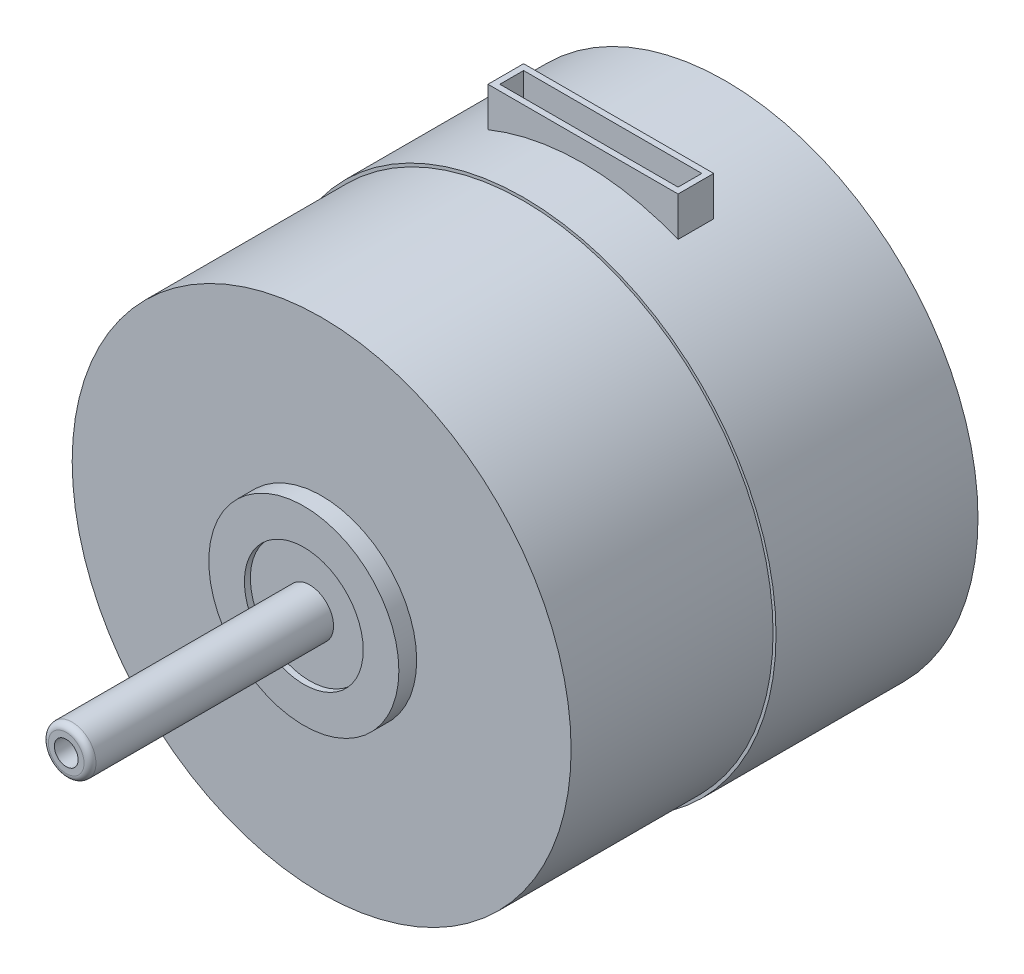
ISO-10303-21;
HEADER;
FILE_DESCRIPTION(('STEP AP214'),'2;1');
FILE_NAME('part.step','',(''),(''),'','','');
FILE_SCHEMA(('AUTOMOTIVE_DESIGN { 1 0 10303 214 1 1 1 1 }'));
ENDSEC;
DATA;
#1=APPLICATION_CONTEXT('core data for automotive mechanical design processes');
#2=APPLICATION_PROTOCOL_DEFINITION('international standard','automotive_design',2000,#1);
#3=PRODUCT_CONTEXT('',#1,'mechanical');
#4=PRODUCT('Part','Part','',(#3));
#5=PRODUCT_RELATED_PRODUCT_CATEGORY('part','',(#4));
#6=PRODUCT_DEFINITION_FORMATION('','',#4);
#7=PRODUCT_DEFINITION_CONTEXT('part definition',#1,'design');
#8=PRODUCT_DEFINITION('design','',#6,#7);
#9=PRODUCT_DEFINITION_SHAPE('','',#8);
#10=(LENGTH_UNIT() NAMED_UNIT(*) SI_UNIT(.MILLI.,.METRE.));
#11=(NAMED_UNIT(*) PLANE_ANGLE_UNIT() SI_UNIT($,.RADIAN.));
#12=(NAMED_UNIT(*) SI_UNIT($,.STERADIAN.) SOLID_ANGLE_UNIT());
#13=UNCERTAINTY_MEASURE_WITH_UNIT(LENGTH_MEASURE(1.E-05),#10,'distance_accuracy_value','');
#14=(GEOMETRIC_REPRESENTATION_CONTEXT(3) GLOBAL_UNCERTAINTY_ASSIGNED_CONTEXT((#13)) GLOBAL_UNIT_ASSIGNED_CONTEXT((#10,
#11,#12)) REPRESENTATION_CONTEXT('',''));
#15=CARTESIAN_POINT('',(0.,0.,0.));
#16=DIRECTION('',(0.,0.,1.));
#17=DIRECTION('',(1.,0.,0.));
#18=AXIS2_PLACEMENT_3D('',#15,#16,#17);
#19=CARTESIAN_POINT('',(0.,0.,-17.));
#20=DIRECTION('',(0.,0.,1.));
#21=DIRECTION('',(1.,0.,0.));
#22=AXIS2_PLACEMENT_3D('',#19,#20,#21);
#23=CYLINDRICAL_SURFACE('',#22,21.25);
#24=CARTESIAN_POINT('',(0.,0.,0.));
#25=DIRECTION('',(0.,0.,-1.));
#26=DIRECTION('',(-1.,0.,0.));
#27=AXIS2_PLACEMENT_3D('',#24,#25,#26);
#28=CIRCLE('',#27,21.25);
#29=CARTESIAN_POINT('',(-21.25,0.,0.));
#30=VERTEX_POINT('',#29);
#31=EDGE_CURVE('E161',#30,#30,#28,.T.);
#32=ORIENTED_EDGE('',*,*,#31,.T.);
#33=EDGE_LOOP('',(#32));
#34=FACE_BOUND('',#33,.T.);
#35=CARTESIAN_POINT('',(0.,0.,-17.));
#36=DIRECTION('',(0.,0.,-1.));
#37=DIRECTION('',(-1.,0.,0.));
#38=AXIS2_PLACEMENT_3D('',#35,#36,#37);
#39=CIRCLE('',#38,21.25);
#40=CARTESIAN_POINT('',(-21.25,0.,-17.));
#41=VERTEX_POINT('',#40);
#42=EDGE_CURVE('E162',#41,#41,#39,.T.);
#43=ORIENTED_EDGE('',*,*,#42,.F.);
#44=EDGE_LOOP('',(#43));
#45=FACE_BOUND('',#44,.T.);
#46=DIRECTION('',(0.,0.,1.));
#47=VECTOR('',#46,1.);
#48=CARTESIAN_POINT('',(-8.,19.68660712261,-17.));
#49=LINE('',#48,#47);
#50=CARTESIAN_POINT('',(-8.,19.68660712261,-8.));
#51=VERTEX_POINT('',#50);
#52=CARTESIAN_POINT('',(-8.,19.68660712261,-5.));
#53=VERTEX_POINT('',#52);
#54=EDGE_CURVE('E11',#51,#53,#49,.T.);
#55=ORIENTED_EDGE('',*,*,#54,.F.);
#56=CARTESIAN_POINT('',(0.,0.,-8.));
#57=DIRECTION('',(0.,0.,1.));
#58=DIRECTION('',(1.,0.,0.));
#59=AXIS2_PLACEMENT_3D('',#56,#57,#58);
#60=CIRCLE('',#59,21.25);
#61=CARTESIAN_POINT('',(8.,19.68660712261,-8.));
#62=VERTEX_POINT('',#61);
#63=EDGE_CURVE('E203',#62,#51,#60,.T.);
#64=ORIENTED_EDGE('',*,*,#63,.F.);
#65=DIRECTION('',(0.,0.,1.));
#66=VECTOR('',#65,1.);
#67=CARTESIAN_POINT('',(8.,19.68660712261,-17.));
#68=LINE('',#67,#66);
#69=CARTESIAN_POINT('',(8.,19.68660712261,-5.));
#70=VERTEX_POINT('',#69);
#71=EDGE_CURVE('E206',#70,#62,#68,.F.);
#72=ORIENTED_EDGE('',*,*,#71,.F.);
#73=CARTESIAN_POINT('',(0.,0.,-5.));
#74=DIRECTION('',(0.,0.,-1.));
#75=DIRECTION('',(-1.,0.,0.));
#76=AXIS2_PLACEMENT_3D('',#73,#74,#75);
#77=CIRCLE('',#76,21.25);
#78=EDGE_CURVE('E47',#53,#70,#77,.T.);
#79=ORIENTED_EDGE('',*,*,#78,.F.);
#80=EDGE_LOOP('',(#55,#64,#72,#79));
#81=FACE_BOUND('',#80,.T.);
#82=ADVANCED_FACE('F39',(#34,#45,#81),#23,.T.);
#83=CARTESIAN_POINT('',(0.,0.,38.5));
#84=DIRECTION('',(0.,0.,-1.));
#85=DIRECTION('',(-1.,0.,0.));
#86=AXIS2_PLACEMENT_3D('',#83,#84,#85);
#87=CYLINDRICAL_SURFACE('',#86,2.);
#88=CARTESIAN_POINT('',(0.,0.,38.));
#89=DIRECTION('',(0.,0.,1.));
#90=DIRECTION('',(1.,0.,0.));
#91=AXIS2_PLACEMENT_3D('',#88,#89,#90);
#92=CIRCLE('',#91,2.);
#93=CARTESIAN_POINT('',(2.,0.,38.));
#94=VERTEX_POINT('',#93);
#95=EDGE_CURVE('E194',#94,#94,#92,.F.);
#96=ORIENTED_EDGE('',*,*,#95,.T.);
#97=EDGE_LOOP('',(#96));
#98=FACE_BOUND('',#97,.T.);
#99=CARTESIAN_POINT('',(0.,0.,18.));
#100=DIRECTION('',(0.,0.,1.));
#101=DIRECTION('',(1.,0.,0.));
#102=AXIS2_PLACEMENT_3D('',#99,#100,#101);
#103=CIRCLE('',#102,2.);
#104=CARTESIAN_POINT('',(2.,0.,18.));
#105=VERTEX_POINT('',#104);
#106=EDGE_CURVE('E168',#105,#105,#103,.T.);
#107=ORIENTED_EDGE('',*,*,#106,.T.);
#108=EDGE_LOOP('',(#107));
#109=FACE_BOUND('',#108,.T.);
#110=ADVANCED_FACE('F236',(#98,#109),#87,.T.);
#111=CARTESIAN_POINT('',(0.,0.,38.5));
#112=DIRECTION('',(0.,0.,1.));
#113=DIRECTION('',(1.,0.,0.));
#114=AXIS2_PLACEMENT_3D('',#111,#112,#113);
#115=PLANE('',#114);
#116=CARTESIAN_POINT('',(0.,0.,38.5));
#117=DIRECTION('',(0.,0.,1.));
#118=DIRECTION('',(1.,0.,0.));
#119=AXIS2_PLACEMENT_3D('',#116,#117,#118);
#120=CIRCLE('',#119,1.);
#121=CARTESIAN_POINT('',(1.,0.,38.5));
#122=VERTEX_POINT('',#121);
#123=EDGE_CURVE('E175',#122,#122,#120,.T.);
#124=ORIENTED_EDGE('',*,*,#123,.F.);
#125=EDGE_LOOP('',(#124));
#126=FACE_BOUND('',#125,.T.);
#127=CARTESIAN_POINT('',(0.,0.,38.5));
#128=DIRECTION('',(0.,0.,1.));
#129=DIRECTION('',(1.,0.,0.));
#130=AXIS2_PLACEMENT_3D('',#127,#128,#129);
#131=CIRCLE('',#130,1.5);
#132=CARTESIAN_POINT('',(1.5,0.,38.5));
#133=VERTEX_POINT('',#132);
#134=EDGE_CURVE('E187',#133,#133,#131,.T.);
#135=ORIENTED_EDGE('',*,*,#134,.T.);
#136=EDGE_LOOP('',(#135));
#137=FACE_BOUND('',#136,.T.);
#138=ADVANCED_FACE('F242',(#126,#137),#115,.T.);
#139=CARTESIAN_POINT('',(0.,0.,38.));
#140=DIRECTION('',(0.,0.,1.));
#141=DIRECTION('',(1.,0.,0.));
#142=AXIS2_PLACEMENT_3D('',#139,#140,#141);
#143=TOROIDAL_SURFACE('',#142,1.5,0.5);
#144=ORIENTED_EDGE('',*,*,#95,.F.);
#145=EDGE_LOOP('',(#144));
#146=FACE_BOUND('',#145,.T.);
#147=ORIENTED_EDGE('',*,*,#134,.F.);
#148=EDGE_LOOP('',(#147));
#149=FACE_BOUND('',#148,.T.);
#150=ADVANCED_FACE('F266',(#146,#149),#143,.T.);
#151=CARTESIAN_POINT('',(0.,0.,36.5));
#152=DIRECTION('',(0.,0.,1.));
#153=DIRECTION('',(1.,0.,0.));
#154=AXIS2_PLACEMENT_3D('',#151,#152,#153);
#155=CYLINDRICAL_SURFACE('',#154,1.);
#156=CARTESIAN_POINT('',(0.,0.,37.));
#157=DIRECTION('',(0.,0.,1.));
#158=DIRECTION('',(1.,0.,0.));
#159=AXIS2_PLACEMENT_3D('',#156,#157,#158);
#160=CIRCLE('',#159,1.);
#161=CARTESIAN_POINT('',(1.,0.,37.));
#162=VERTEX_POINT('',#161);
#163=EDGE_CURVE('E200',#162,#162,#160,.F.);
#164=ORIENTED_EDGE('',*,*,#163,.T.);
#165=EDGE_LOOP('',(#164));
#166=FACE_BOUND('',#165,.T.);
#167=ORIENTED_EDGE('',*,*,#123,.T.);
#168=EDGE_LOOP('',(#167));
#169=FACE_BOUND('',#168,.T.);
#170=ADVANCED_FACE('F262',(#166,#169),#155,.F.);
#171=CARTESIAN_POINT('',(0.,0.,36.5));
#172=DIRECTION('',(0.,0.,1.));
#173=DIRECTION('',(1.,0.,0.));
#174=AXIS2_PLACEMENT_3D('',#171,#172,#173);
#175=PLANE('',#174);
#176=CARTESIAN_POINT('',(0.,0.,36.5));
#177=DIRECTION('',(0.,0.,1.));
#178=DIRECTION('',(1.,0.,0.));
#179=AXIS2_PLACEMENT_3D('',#176,#177,#178);
#180=CIRCLE('',#179,0.5);
#181=CARTESIAN_POINT('',(0.5,0.,36.5));
#182=VERTEX_POINT('',#181);
#183=EDGE_CURVE('E197',#182,#182,#180,.T.);
#184=ORIENTED_EDGE('',*,*,#183,.T.);
#185=EDGE_LOOP('',(#184));
#186=FACE_BOUND('',#185,.T.);
#187=ADVANCED_FACE('F259',(#186),#175,.T.);
#188=CARTESIAN_POINT('',(0.,0.,37.));
#189=DIRECTION('',(0.,0.,1.));
#190=DIRECTION('',(1.,0.,0.));
#191=AXIS2_PLACEMENT_3D('',#188,#189,#190);
#192=DEGENERATE_TOROIDAL_SURFACE('',#191,0.5,0.5,.T.);
#193=ORIENTED_EDGE('',*,*,#163,.F.);
#194=EDGE_LOOP('',(#193));
#195=FACE_BOUND('',#194,.T.);
#196=ORIENTED_EDGE('',*,*,#183,.F.);
#197=EDGE_LOOP('',(#196));
#198=FACE_BOUND('',#197,.T.);
#199=ADVANCED_FACE('F41',(#195,#198),#192,.F.);
#200=CARTESIAN_POINT('',(0.,0.,18.));
#201=DIRECTION('',(0.,0.,1.));
#202=DIRECTION('',(1.,0.,0.));
#203=AXIS2_PLACEMENT_3D('',#200,#201,#202);
#204=CYLINDRICAL_SURFACE('',#203,5.);
#205=CARTESIAN_POINT('',(0.,0.,18.));
#206=DIRECTION('',(0.,0.,1.));
#207=DIRECTION('',(1.,0.,0.));
#208=AXIS2_PLACEMENT_3D('',#205,#206,#207);
#209=CIRCLE('',#208,5.);
#210=CARTESIAN_POINT('',(5.,0.,18.));
#211=VERTEX_POINT('',#210);
#212=EDGE_CURVE('E172',#211,#211,#209,.T.);
#213=ORIENTED_EDGE('',*,*,#212,.F.);
#214=EDGE_LOOP('',(#213));
#215=FACE_BOUND('',#214,.T.);
#216=CARTESIAN_POINT('',(0.,0.,18.5));
#217=DIRECTION('',(0.,0.,1.));
#218=DIRECTION('',(1.,0.,0.));
#219=AXIS2_PLACEMENT_3D('',#216,#217,#218);
#220=CIRCLE('',#219,5.);
#221=CARTESIAN_POINT('',(5.,0.,18.5));
#222=VERTEX_POINT('',#221);
#223=EDGE_CURVE('E171',#222,#222,#220,.T.);
#224=ORIENTED_EDGE('',*,*,#223,.T.);
#225=EDGE_LOOP('',(#224));
#226=FACE_BOUND('',#225,.T.);
#227=ADVANCED_FACE('F254',(#215,#226),#204,.F.);
#228=CARTESIAN_POINT('',(0.,0.,18.));
#229=DIRECTION('',(0.,0.,1.));
#230=DIRECTION('',(1.,0.,0.));
#231=AXIS2_PLACEMENT_3D('',#228,#229,#230);
#232=PLANE('',#231);
#233=ORIENTED_EDGE('',*,*,#106,.F.);
#234=EDGE_LOOP('',(#233));
#235=FACE_BOUND('',#234,.T.);
#236=ORIENTED_EDGE('',*,*,#212,.T.);
#237=EDGE_LOOP('',(#236));
#238=FACE_BOUND('',#237,.T.);
#239=ADVANCED_FACE('F250',(#235,#238),#232,.T.);
#240=CARTESIAN_POINT('',(0.,0.,17.));
#241=DIRECTION('',(0.,0.,-1.));
#242=DIRECTION('',(-1.,0.,0.));
#243=AXIS2_PLACEMENT_3D('',#240,#241,#242);
#244=CYLINDRICAL_SURFACE('',#243,21.);
#245=CARTESIAN_POINT('',(0.,0.,17.));
#246=DIRECTION('',(0.,0.,1.));
#247=DIRECTION('',(1.,0.,0.));
#248=AXIS2_PLACEMENT_3D('',#245,#246,#247);
#249=CIRCLE('',#248,21.);
#250=CARTESIAN_POINT('',(21.,0.,17.));
#251=VERTEX_POINT('',#250);
#252=EDGE_CURVE('E183',#251,#251,#249,.T.);
#253=ORIENTED_EDGE('',*,*,#252,.F.);
#254=EDGE_LOOP('',(#253));
#255=FACE_BOUND('',#254,.T.);
#256=CARTESIAN_POINT('',(0.,0.,0.));
#257=DIRECTION('',(0.,0.,1.));
#258=DIRECTION('',(1.,0.,0.));
#259=AXIS2_PLACEMENT_3D('',#256,#257,#258);
#260=CIRCLE('',#259,21.);
#261=CARTESIAN_POINT('',(21.,0.,0.));
#262=VERTEX_POINT('',#261);
#263=EDGE_CURVE('E165',#262,#262,#260,.T.);
#264=ORIENTED_EDGE('',*,*,#263,.T.);
#265=EDGE_LOOP('',(#264));
#266=FACE_BOUND('',#265,.T.);
#267=ADVANCED_FACE('F253',(#255,#266),#244,.T.);
#268=CARTESIAN_POINT('',(0.,0.,17.));
#269=DIRECTION('',(0.,0.,1.));
#270=DIRECTION('',(1.,0.,0.));
#271=AXIS2_PLACEMENT_3D('',#268,#269,#270);
#272=PLANE('',#271);
#273=CARTESIAN_POINT('',(0.,0.,17.));
#274=DIRECTION('',(0.,0.,1.));
#275=DIRECTION('',(1.,0.,0.));
#276=AXIS2_PLACEMENT_3D('',#273,#274,#275);
#277=CIRCLE('',#276,8.);
#278=CARTESIAN_POINT('',(8.,0.,17.));
#279=VERTEX_POINT('',#278);
#280=EDGE_CURVE('E184',#279,#279,#277,.T.);
#281=ORIENTED_EDGE('',*,*,#280,.F.);
#282=EDGE_LOOP('',(#281));
#283=FACE_BOUND('',#282,.T.);
#284=ORIENTED_EDGE('',*,*,#252,.T.);
#285=EDGE_LOOP('',(#284));
#286=FACE_BOUND('',#285,.T.);
#287=ADVANCED_FACE('F279',(#283,#286),#272,.T.);
#288=CARTESIAN_POINT('',(0.,0.,18.5));
#289=DIRECTION('',(0.,0.,-1.));
#290=DIRECTION('',(-1.,0.,0.));
#291=AXIS2_PLACEMENT_3D('',#288,#289,#290);
#292=CYLINDRICAL_SURFACE('',#291,8.);
#293=CARTESIAN_POINT('',(0.,0.,18.5));
#294=DIRECTION('',(0.,0.,1.));
#295=DIRECTION('',(1.,0.,0.));
#296=AXIS2_PLACEMENT_3D('',#293,#294,#295);
#297=CIRCLE('',#296,8.);
#298=CARTESIAN_POINT('',(8.,0.,18.5));
#299=VERTEX_POINT('',#298);
#300=EDGE_CURVE('E180',#299,#299,#297,.T.);
#301=ORIENTED_EDGE('',*,*,#300,.F.);
#302=EDGE_LOOP('',(#301));
#303=FACE_BOUND('',#302,.T.);
#304=ORIENTED_EDGE('',*,*,#280,.T.);
#305=EDGE_LOOP('',(#304));
#306=FACE_BOUND('',#305,.T.);
#307=ADVANCED_FACE('F275',(#303,#306),#292,.T.);
#308=CARTESIAN_POINT('',(0.,0.,18.5));
#309=DIRECTION('',(0.,0.,1.));
#310=DIRECTION('',(1.,0.,0.));
#311=AXIS2_PLACEMENT_3D('',#308,#309,#310);
#312=PLANE('',#311);
#313=ORIENTED_EDGE('',*,*,#223,.F.);
#314=EDGE_LOOP('',(#313));
#315=FACE_BOUND('',#314,.T.);
#316=ORIENTED_EDGE('',*,*,#300,.T.);
#317=EDGE_LOOP('',(#316));
#318=FACE_BOUND('',#317,.T.);
#319=ADVANCED_FACE('F271',(#315,#318),#312,.T.);
#320=CARTESIAN_POINT('',(0.,0.,-17.));
#321=DIRECTION('',(0.,0.,-1.));
#322=DIRECTION('',(-1.,0.,0.));
#323=AXIS2_PLACEMENT_3D('',#320,#321,#322);
#324=PLANE('',#323);
#325=ORIENTED_EDGE('',*,*,#42,.T.);
#326=EDGE_LOOP('',(#325));
#327=FACE_BOUND('',#326,.T.);
#328=ADVANCED_FACE('F274',(#327),#324,.T.);
#329=CARTESIAN_POINT('',(0.,0.,0.));
#330=DIRECTION('',(0.,0.,-1.));
#331=DIRECTION('',(-1.,0.,0.));
#332=AXIS2_PLACEMENT_3D('',#329,#330,#331);
#333=PLANE('',#332);
#334=ORIENTED_EDGE('',*,*,#263,.F.);
#335=EDGE_LOOP('',(#334));
#336=FACE_BOUND('',#335,.T.);
#337=ORIENTED_EDGE('',*,*,#31,.F.);
#338=EDGE_LOOP('',(#337));
#339=FACE_BOUND('',#338,.T.);
#340=ADVANCED_FACE('F248',(#336,#339),#333,.F.);
#341=CARTESIAN_POINT('',(-8.,23.,-8.));
#342=DIRECTION('',(1.,0.,0.));
#343=DIRECTION('',(0.,0.,-1.));
#344=AXIS2_PLACEMENT_3D('',#341,#342,#343);
#345=PLANE('',#344);
#346=DIRECTION('',(0.,-1.,0.));
#347=VECTOR('',#346,1.);
#348=CARTESIAN_POINT('',(-8.,23.,-8.));
#349=LINE('',#348,#347);
#350=CARTESIAN_POINT('',(-8.,23.,-8.));
#351=VERTEX_POINT('',#350);
#352=EDGE_CURVE('E149',#351,#51,#349,.T.);
#353=ORIENTED_EDGE('',*,*,#352,.T.);
#354=ORIENTED_EDGE('',*,*,#54,.T.);
#355=DIRECTION('',(0.,-1.,0.));
#356=VECTOR('',#355,1.);
#357=CARTESIAN_POINT('',(-8.,23.,-5.));
#358=LINE('',#357,#356);
#359=CARTESIAN_POINT('',(-8.,23.,-5.));
#360=VERTEX_POINT('',#359);
#361=EDGE_CURVE('E158',#360,#53,#358,.T.);
#362=ORIENTED_EDGE('',*,*,#361,.F.);
#363=DIRECTION('',(0.,0.,1.));
#364=VECTOR('',#363,1.);
#365=CARTESIAN_POINT('',(-8.,23.,-8.));
#366=LINE('',#365,#364);
#367=EDGE_CURVE('E137',#351,#360,#366,.T.);
#368=ORIENTED_EDGE('',*,*,#367,.F.);
#369=EDGE_LOOP('',(#353,#354,#362,#368));
#370=FACE_BOUND('',#369,.T.);
#371=ADVANCED_FACE('F222',(#370),#345,.F.);
#372=CARTESIAN_POINT('',(8.,23.,-8.));
#373=DIRECTION('',(-1.,0.,0.));
#374=DIRECTION('',(0.,0.,1.));
#375=AXIS2_PLACEMENT_3D('',#372,#373,#374);
#376=PLANE('',#375);
#377=DIRECTION('',(0.,-1.,0.));
#378=VECTOR('',#377,1.);
#379=CARTESIAN_POINT('',(8.,23.,-5.));
#380=LINE('',#379,#378);
#381=CARTESIAN_POINT('',(8.,23.,-5.));
#382=VERTEX_POINT('',#381);
#383=EDGE_CURVE('E155',#382,#70,#380,.T.);
#384=ORIENTED_EDGE('',*,*,#383,.T.);
#385=ORIENTED_EDGE('',*,*,#71,.T.);
#386=DIRECTION('',(0.,-1.,0.));
#387=VECTOR('',#386,1.);
#388=CARTESIAN_POINT('',(8.,23.,-8.));
#389=LINE('',#388,#387);
#390=CARTESIAN_POINT('',(8.,23.,-8.));
#391=VERTEX_POINT('',#390);
#392=EDGE_CURVE('E152',#391,#62,#389,.T.);
#393=ORIENTED_EDGE('',*,*,#392,.F.);
#394=DIRECTION('',(0.,0.,-1.));
#395=VECTOR('',#394,1.);
#396=CARTESIAN_POINT('',(8.,23.,-8.));
#397=LINE('',#396,#395);
#398=EDGE_CURVE('E145',#382,#391,#397,.T.);
#399=ORIENTED_EDGE('',*,*,#398,.F.);
#400=EDGE_LOOP('',(#384,#385,#393,#399));
#401=FACE_BOUND('',#400,.T.);
#402=ADVANCED_FACE('F214',(#401),#376,.F.);
#403=CARTESIAN_POINT('',(-8.,23.,-5.));
#404=DIRECTION('',(0.,0.,-1.));
#405=DIRECTION('',(-1.,0.,0.));
#406=AXIS2_PLACEMENT_3D('',#403,#404,#405);
#407=PLANE('',#406);
#408=ORIENTED_EDGE('',*,*,#361,.T.);
#409=ORIENTED_EDGE('',*,*,#78,.T.);
#410=ORIENTED_EDGE('',*,*,#383,.F.);
#411=DIRECTION('',(1.,0.,0.));
#412=VECTOR('',#411,1.);
#413=CARTESIAN_POINT('',(-8.,23.,-5.));
#414=LINE('',#413,#412);
#415=EDGE_CURVE('E143',#360,#382,#414,.T.);
#416=ORIENTED_EDGE('',*,*,#415,.F.);
#417=EDGE_LOOP('',(#408,#409,#410,#416));
#418=FACE_BOUND('',#417,.T.);
#419=ADVANCED_FACE('F210',(#418),#407,.F.);
#420=CARTESIAN_POINT('',(-8.,23.,-8.));
#421=DIRECTION('',(0.,0.,1.));
#422=DIRECTION('',(1.,0.,0.));
#423=AXIS2_PLACEMENT_3D('',#420,#421,#422);
#424=PLANE('',#423);
#425=ORIENTED_EDGE('',*,*,#392,.T.);
#426=ORIENTED_EDGE('',*,*,#63,.T.);
#427=ORIENTED_EDGE('',*,*,#352,.F.);
#428=DIRECTION('',(-1.,0.,0.));
#429=VECTOR('',#428,1.);
#430=CARTESIAN_POINT('',(-8.,23.,-8.));
#431=LINE('',#430,#429);
#432=EDGE_CURVE('E147',#391,#351,#431,.T.);
#433=ORIENTED_EDGE('',*,*,#432,.F.);
#434=EDGE_LOOP('',(#425,#426,#427,#433));
#435=FACE_BOUND('',#434,.T.);
#436=ADVANCED_FACE('F224',(#435),#424,.F.);
#437=CARTESIAN_POINT('',(0.,23.,0.));
#438=DIRECTION('',(0.,1.,0.));
#439=DIRECTION('',(0.,0.,1.));
#440=AXIS2_PLACEMENT_3D('',#437,#438,#439);
#441=PLANE('',#440);
#442=DIRECTION('',(0.,0.,1.));
#443=VECTOR('',#442,1.);
#444=CARTESIAN_POINT('',(-7.5,23.,-7.5));
#445=LINE('',#444,#443);
#446=CARTESIAN_POINT('',(-7.5,23.,-7.5));
#447=VERTEX_POINT('',#446);
#448=CARTESIAN_POINT('',(-7.5,23.,-5.5));
#449=VERTEX_POINT('',#448);
#450=EDGE_CURVE('E54',#447,#449,#445,.T.);
#451=ORIENTED_EDGE('',*,*,#450,.F.);
#452=DIRECTION('',(-1.,0.,0.));
#453=VECTOR('',#452,1.);
#454=CARTESIAN_POINT('',(-7.5,23.,-7.5));
#455=LINE('',#454,#453);
#456=CARTESIAN_POINT('',(7.5,23.,-7.5));
#457=VERTEX_POINT('',#456);
#458=EDGE_CURVE('E122',#457,#447,#455,.T.);
#459=ORIENTED_EDGE('',*,*,#458,.F.);
#460=DIRECTION('',(0.,0.,-1.));
#461=VECTOR('',#460,1.);
#462=CARTESIAN_POINT('',(7.5,23.,-7.5));
#463=LINE('',#462,#461);
#464=CARTESIAN_POINT('',(7.5,23.,-5.5));
#465=VERTEX_POINT('',#464);
#466=EDGE_CURVE('E125',#465,#457,#463,.T.);
#467=ORIENTED_EDGE('',*,*,#466,.F.);
#468=DIRECTION('',(1.,0.,0.));
#469=VECTOR('',#468,1.);
#470=CARTESIAN_POINT('',(-7.5,23.,-5.5));
#471=LINE('',#470,#469);
#472=EDGE_CURVE('E131',#449,#465,#471,.T.);
#473=ORIENTED_EDGE('',*,*,#472,.F.);
#474=EDGE_LOOP('',(#451,#459,#467,#473));
#475=FACE_BOUND('',#474,.T.);
#476=ORIENTED_EDGE('',*,*,#367,.T.);
#477=ORIENTED_EDGE('',*,*,#415,.T.);
#478=ORIENTED_EDGE('',*,*,#398,.T.);
#479=ORIENTED_EDGE('',*,*,#432,.T.);
#480=EDGE_LOOP('',(#476,#477,#478,#479));
#481=FACE_BOUND('',#480,.T.);
#482=ADVANCED_FACE('F218',(#475,#481),#441,.T.);
#483=CARTESIAN_POINT('',(-7.5,20.,-7.5));
#484=DIRECTION('',(-1.,0.,0.));
#485=DIRECTION('',(0.,0.,1.));
#486=AXIS2_PLACEMENT_3D('',#483,#484,#485);
#487=PLANE('',#486);
#488=ORIENTED_EDGE('',*,*,#450,.T.);
#489=DIRECTION('',(0.,1.,0.));
#490=VECTOR('',#489,1.);
#491=CARTESIAN_POINT('',(-7.5,20.,-5.5));
#492=LINE('',#491,#490);
#493=CARTESIAN_POINT('',(-7.5,20.,-5.5));
#494=VERTEX_POINT('',#493);
#495=EDGE_CURVE('E100',#494,#449,#492,.T.);
#496=ORIENTED_EDGE('',*,*,#495,.F.);
#497=DIRECTION('',(0.,0.,1.));
#498=VECTOR('',#497,1.);
#499=CARTESIAN_POINT('',(-7.5,20.,-7.5));
#500=LINE('',#499,#498);
#501=CARTESIAN_POINT('',(-7.5,20.,-7.5));
#502=VERTEX_POINT('',#501);
#503=EDGE_CURVE('E104',#502,#494,#500,.T.);
#504=ORIENTED_EDGE('',*,*,#503,.F.);
#505=DIRECTION('',(0.,1.,0.));
#506=VECTOR('',#505,1.);
#507=CARTESIAN_POINT('',(-7.5,20.,-7.5));
#508=LINE('',#507,#506);
#509=EDGE_CURVE('E135',#502,#447,#508,.T.);
#510=ORIENTED_EDGE('',*,*,#509,.T.);
#511=EDGE_LOOP('',(#488,#496,#504,#510));
#512=FACE_BOUND('',#511,.T.);
#513=ADVANCED_FACE('F102',(#512),#487,.F.);
#514=CARTESIAN_POINT('',(-7.5,20.,-7.5));
#515=DIRECTION('',(0.,0.,-1.));
#516=DIRECTION('',(-1.,0.,0.));
#517=AXIS2_PLACEMENT_3D('',#514,#515,#516);
#518=PLANE('',#517);
#519=ORIENTED_EDGE('',*,*,#458,.T.);
#520=ORIENTED_EDGE('',*,*,#509,.F.);
#521=DIRECTION('',(-1.,0.,0.));
#522=VECTOR('',#521,1.);
#523=CARTESIAN_POINT('',(-7.5,20.,-7.5));
#524=LINE('',#523,#522);
#525=CARTESIAN_POINT('',(7.5,20.,-7.5));
#526=VERTEX_POINT('',#525);
#527=EDGE_CURVE('E110',#526,#502,#524,.T.);
#528=ORIENTED_EDGE('',*,*,#527,.F.);
#529=DIRECTION('',(0.,1.,0.));
#530=VECTOR('',#529,1.);
#531=CARTESIAN_POINT('',(7.5,20.,-7.5));
#532=LINE('',#531,#530);
#533=EDGE_CURVE('E138',#526,#457,#532,.T.);
#534=ORIENTED_EDGE('',*,*,#533,.T.);
#535=EDGE_LOOP('',(#519,#520,#528,#534));
#536=FACE_BOUND('',#535,.T.);
#537=ADVANCED_FACE('F348',(#536),#518,.F.);
#538=CARTESIAN_POINT('',(7.5,20.,-7.5));
#539=DIRECTION('',(1.,0.,0.));
#540=DIRECTION('',(0.,0.,-1.));
#541=AXIS2_PLACEMENT_3D('',#538,#539,#540);
#542=PLANE('',#541);
#543=ORIENTED_EDGE('',*,*,#466,.T.);
#544=ORIENTED_EDGE('',*,*,#533,.F.);
#545=DIRECTION('',(0.,0.,-1.));
#546=VECTOR('',#545,1.);
#547=CARTESIAN_POINT('',(7.5,20.,-7.5));
#548=LINE('',#547,#546);
#549=CARTESIAN_POINT('',(7.5,20.,-5.5));
#550=VERTEX_POINT('',#549);
#551=EDGE_CURVE('E118',#550,#526,#548,.T.);
#552=ORIENTED_EDGE('',*,*,#551,.F.);
#553=DIRECTION('',(0.,1.,0.));
#554=VECTOR('',#553,1.);
#555=CARTESIAN_POINT('',(7.5,20.,-5.5));
#556=LINE('',#555,#554);
#557=EDGE_CURVE('E109',#550,#465,#556,.T.);
#558=ORIENTED_EDGE('',*,*,#557,.T.);
#559=EDGE_LOOP('',(#543,#544,#552,#558));
#560=FACE_BOUND('',#559,.T.);
#561=ADVANCED_FACE('F357',(#560),#542,.F.);
#562=CARTESIAN_POINT('',(-7.5,20.,-5.5));
#563=DIRECTION('',(0.,0.,1.));
#564=DIRECTION('',(1.,0.,0.));
#565=AXIS2_PLACEMENT_3D('',#562,#563,#564);
#566=PLANE('',#565);
#567=ORIENTED_EDGE('',*,*,#472,.T.);
#568=ORIENTED_EDGE('',*,*,#557,.F.);
#569=DIRECTION('',(1.,0.,0.));
#570=VECTOR('',#569,1.);
#571=CARTESIAN_POINT('',(-7.5,20.,-5.5));
#572=LINE('',#571,#570);
#573=EDGE_CURVE('E113',#494,#550,#572,.T.);
#574=ORIENTED_EDGE('',*,*,#573,.F.);
#575=ORIENTED_EDGE('',*,*,#495,.T.);
#576=EDGE_LOOP('',(#567,#568,#574,#575));
#577=FACE_BOUND('',#576,.T.);
#578=ADVANCED_FACE('F114',(#577),#566,.F.);
#579=CARTESIAN_POINT('',(0.,20.,0.));
#580=DIRECTION('',(0.,1.,0.));
#581=DIRECTION('',(0.,0.,1.));
#582=AXIS2_PLACEMENT_3D('',#579,#580,#581);
#583=PLANE('',#582);
#584=ORIENTED_EDGE('',*,*,#503,.T.);
#585=ORIENTED_EDGE('',*,*,#573,.T.);
#586=ORIENTED_EDGE('',*,*,#551,.T.);
#587=ORIENTED_EDGE('',*,*,#527,.T.);
#588=EDGE_LOOP('',(#584,#585,#586,#587));
#589=FACE_BOUND('',#588,.T.);
#590=ADVANCED_FACE('F120',(#589),#583,.T.);
#591=CLOSED_SHELL('',(#82,#110,#138,#150,#170,#187,#199,#227,#239,#267,#287,#307,#319,#328,#340,
#371,#402,#419,#436,#482,#513,#537,#561,#578,#590));
#592=MANIFOLD_SOLID_BREP('B2',#591);
#593=ADVANCED_BREP_SHAPE_REPRESENTATION('',(#18,#592),#14);
#594=SHAPE_DEFINITION_REPRESENTATION(#9,#593);
ENDSEC;
END-ISO-10303-21;
